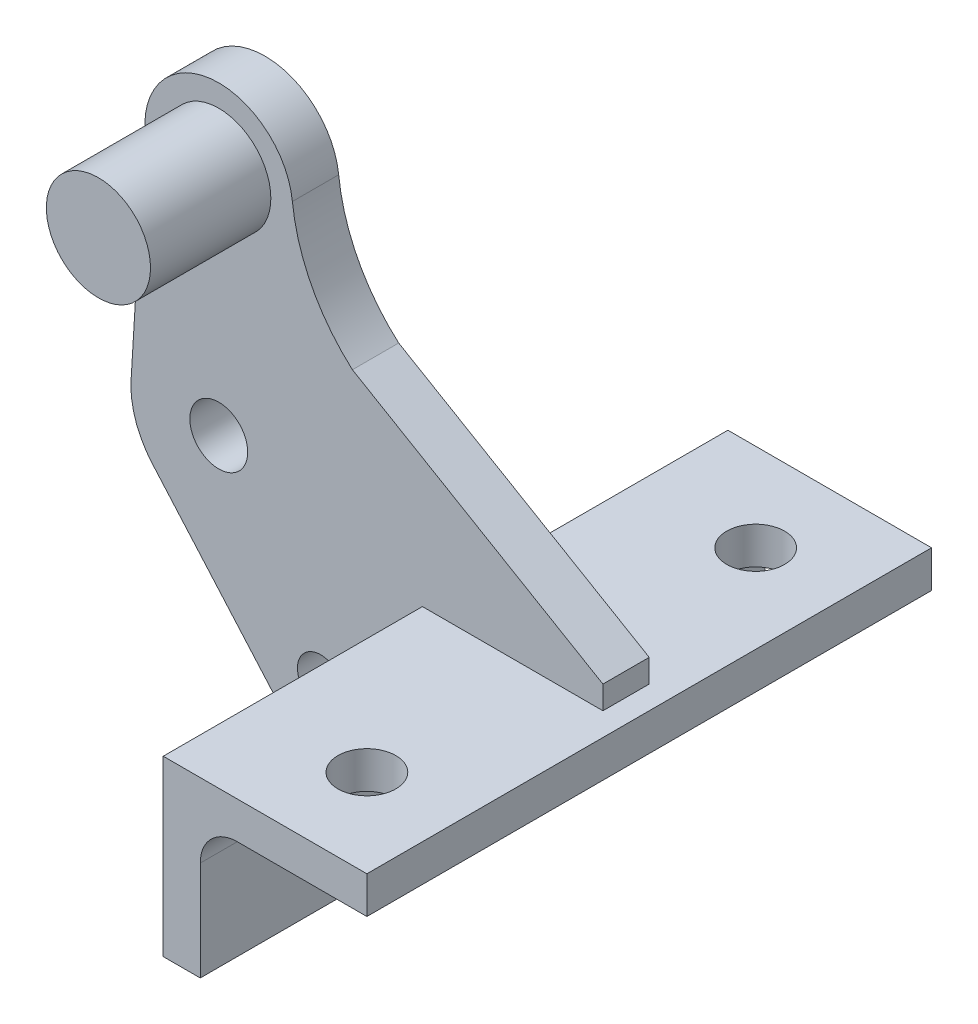
ISO-10303-21;
HEADER;
FILE_DESCRIPTION(('STEP AP214'),'2;1');
FILE_NAME('part.step','',(''),(''),'','','');
FILE_SCHEMA(('AUTOMOTIVE_DESIGN { 1 0 10303 214 1 1 1 1 }'));
ENDSEC;
DATA;
#1=APPLICATION_CONTEXT('core data for automotive mechanical design processes');
#2=APPLICATION_PROTOCOL_DEFINITION('international standard','automotive_design',2000,#1);
#3=PRODUCT_CONTEXT('',#1,'mechanical');
#4=PRODUCT('Part','Part','',(#3));
#5=PRODUCT_RELATED_PRODUCT_CATEGORY('part','',(#4));
#6=PRODUCT_DEFINITION_FORMATION('','',#4);
#7=PRODUCT_DEFINITION_CONTEXT('part definition',#1,'design');
#8=PRODUCT_DEFINITION('design','',#6,#7);
#9=PRODUCT_DEFINITION_SHAPE('','',#8);
#10=(LENGTH_UNIT() NAMED_UNIT(*) SI_UNIT(.MILLI.,.METRE.));
#11=(NAMED_UNIT(*) PLANE_ANGLE_UNIT() SI_UNIT($,.RADIAN.));
#12=(NAMED_UNIT(*) SI_UNIT($,.STERADIAN.) SOLID_ANGLE_UNIT());
#13=UNCERTAINTY_MEASURE_WITH_UNIT(LENGTH_MEASURE(1.E-05),#10,'distance_accuracy_value','');
#14=(GEOMETRIC_REPRESENTATION_CONTEXT(3) GLOBAL_UNCERTAINTY_ASSIGNED_CONTEXT((#13)) GLOBAL_UNIT_ASSIGNED_CONTEXT((#10,
#11,#12)) REPRESENTATION_CONTEXT('',''));
#15=CARTESIAN_POINT('',(0.,0.,0.));
#16=DIRECTION('',(0.,0.,1.));
#17=DIRECTION('',(1.,0.,0.));
#18=AXIS2_PLACEMENT_3D('',#15,#16,#17);
#19=CARTESIAN_POINT('',(0.,0.,10.));
#20=DIRECTION('',(0.,0.,1.));
#21=DIRECTION('',(1.,0.,0.));
#22=AXIS2_PLACEMENT_3D('',#19,#20,#21);
#23=PLANE('',#22);
#24=CARTESIAN_POINT('',(-44.,25.,10.));
#25=DIRECTION('',(0.,0.,1.));
#26=DIRECTION('',(1.,0.,0.));
#27=AXIS2_PLACEMENT_3D('',#24,#25,#26);
#28=CIRCLE('',#27,10.);
#29=CARTESIAN_POINT('',(-34.,25.,10.));
#30=VERTEX_POINT('',#29);
#31=EDGE_CURVE('E263',#30,#30,#28,.T.);
#32=ORIENTED_EDGE('',*,*,#31,.F.);
#33=EDGE_LOOP('',(#32));
#34=FACE_BOUND('',#33,.T.);
#35=CARTESIAN_POINT('',(-88.,95.,10.));
#36=DIRECTION('',(0.,0.,1.));
#37=DIRECTION('',(1.,0.,0.));
#38=AXIS2_PLACEMENT_3D('',#35,#36,#37);
#39=CIRCLE('',#38,12.5);
#40=CARTESIAN_POINT('',(-75.5,95.,10.));
#41=VERTEX_POINT('',#40);
#42=EDGE_CURVE('E260',#41,#41,#39,.T.);
#43=ORIENTED_EDGE('',*,*,#42,.F.);
#44=EDGE_LOOP('',(#43));
#45=FACE_BOUND('',#44,.T.);
#46=CARTESIAN_POINT('',(21.3434954626932,207.,10.));
#47=DIRECTION('',(0.,0.,1.));
#48=DIRECTION('',(1.,0.,0.));
#49=AXIS2_PLACEMENT_3D('',#46,#47,#48);
#50=CIRCLE('',#49,78.);
#51=CARTESIAN_POINT('',(-56.1909831381256,198.490909090909,10.));
#52=VERTEX_POINT('',#51);
#53=CARTESIAN_POINT('',(-30.24635358457,148.497970331957,10.));
#54=VERTEX_POINT('',#53);
#55=EDGE_CURVE('E217',#52,#54,#50,.T.);
#56=ORIENTED_EDGE('',*,*,#55,.F.);
#57=CARTESIAN_POINT('',(-88.,195.,10.));
#58=DIRECTION('',(0.,0.,1.));
#59=DIRECTION('',(1.,0.,0.));
#60=AXIS2_PLACEMENT_3D('',#57,#58,#59);
#61=CIRCLE('',#60,32.);
#62=CARTESIAN_POINT('',(-119.660096955048,199.651694400639,10.));
#63=VERTEX_POINT('',#62);
#64=EDGE_CURVE('E232',#63,#52,#61,.F.);
#65=ORIENTED_EDGE('',*,*,#64,.F.);
#66=DIRECTION('',(0.0604701252704725,0.998170007538682,0.));
#67=VECTOR('',#66,1.);
#68=CARTESIAN_POINT('',(-131.273413070395,7.9526730648052,10.));
#69=LINE('',#68,#67);
#70=CARTESIAN_POINT('',(-126.,95.,10.));
#71=VERTEX_POINT('',#70);
#72=EDGE_CURVE('E235',#71,#63,#69,.T.);
#73=ORIENTED_EDGE('',*,*,#72,.F.);
#74=CARTESIAN_POINT('',(-88.,95.,10.));
#75=DIRECTION('',(0.,0.,1.));
#76=DIRECTION('',(1.,0.,0.));
#77=AXIS2_PLACEMENT_3D('',#74,#75,#76);
#78=CIRCLE('',#77,38.);
#79=CARTESIAN_POINT('',(-116.254110735657,69.5892694607719,10.));
#80=VERTEX_POINT('',#79);
#81=EDGE_CURVE('E238',#80,#71,#78,.F.);
#82=ORIENTED_EDGE('',*,*,#81,.F.);
#83=DIRECTION('',(0.658660174281462,-0.752440545701462,0.));
#84=VECTOR('',#83,1.);
#85=CARTESIAN_POINT('',(-31.3305905982339,-27.4257047705155,10.));
#86=LINE('',#85,#84);
#87=CARTESIAN_POINT('',(-62.5882307471425,8.28241411892891,10.));
#88=VERTEX_POINT('',#87);
#89=EDGE_CURVE('E241',#80,#88,#86,.T.);
#90=ORIENTED_EDGE('',*,*,#89,.T.);
#91=CARTESIAN_POINT('',(-44.,25.,10.));
#92=DIRECTION('',(0.,0.,1.));
#93=DIRECTION('',(1.,0.,0.));
#94=AXIS2_PLACEMENT_3D('',#91,#92,#93);
#95=CIRCLE('',#94,25.);
#96=CARTESIAN_POINT('',(-44.,0.,10.));
#97=VERTEX_POINT('',#96);
#98=EDGE_CURVE('E244',#97,#88,#95,.F.);
#99=ORIENTED_EDGE('',*,*,#98,.F.);
#100=DIRECTION('',(-1.,0.,0.));
#101=VECTOR('',#100,1.);
#102=CARTESIAN_POINT('',(0.,0.,10.));
#103=LINE('',#102,#101);
#104=CARTESIAN_POINT('',(0.,0.,10.));
#105=VERTEX_POINT('',#104);
#106=EDGE_CURVE('E247',#105,#97,#103,.T.);
#107=ORIENTED_EDGE('',*,*,#106,.F.);
#108=DIRECTION('',(0.,1.,0.));
#109=VECTOR('',#108,1.);
#110=CARTESIAN_POINT('',(0.,0.,10.));
#111=LINE('',#110,#109);
#112=CARTESIAN_POINT('',(0.,75.,10.));
#113=VERTEX_POINT('',#112);
#114=EDGE_CURVE('E250',#105,#113,#111,.T.);
#115=ORIENTED_EDGE('',*,*,#114,.T.);
#116=DIRECTION('',(1.,0.,0.));
#117=VECTOR('',#116,1.);
#118=CARTESIAN_POINT('',(0.,75.,10.));
#119=LINE('',#118,#117);
#120=CARTESIAN_POINT('',(78.,75.,10.));
#121=VERTEX_POINT('',#120);
#122=EDGE_CURVE('E252',#113,#121,#119,.T.);
#123=ORIENTED_EDGE('',*,*,#122,.T.);
#124=DIRECTION('',(0.,1.,0.));
#125=VECTOR('',#124,1.);
#126=CARTESIAN_POINT('',(78.,0.,10.));
#127=LINE('',#126,#125);
#128=CARTESIAN_POINT('',(78.,85.,10.));
#129=VERTEX_POINT('',#128);
#130=EDGE_CURVE('E254',#121,#129,#127,.T.);
#131=ORIENTED_EDGE('',*,*,#130,.T.);
#132=DIRECTION('',(0.862547709185101,-0.505975739912038,0.));
#133=VECTOR('',#132,1.);
#134=CARTESIAN_POINT('',(57.0652913575747,97.28042760116,10.));
#135=LINE('',#134,#133);
#136=EDGE_CURVE('E257',#54,#129,#135,.T.);
#137=ORIENTED_EDGE('',*,*,#136,.F.);
#138=EDGE_LOOP('',(#56,#65,#73,#82,#90,#99,#107,#115,#123,#131,#137));
#139=FACE_BOUND('',#138,.T.);
#140=CARTESIAN_POINT('',(-88.,195.,10.));
#141=DIRECTION('',(0.,0.,1.));
#142=DIRECTION('',(1.,0.,0.));
#143=AXIS2_PLACEMENT_3D('',#140,#141,#142);
#144=CIRCLE('',#143,22.5);
#145=CARTESIAN_POINT('',(-65.5,195.,10.));
#146=VERTEX_POINT('',#145);
#147=EDGE_CURVE('E36',#146,#146,#144,.T.);
#148=ORIENTED_EDGE('',*,*,#147,.F.);
#149=EDGE_LOOP('',(#148));
#150=FACE_BOUND('',#149,.T.);
#151=ADVANCED_FACE('F32',(#34,#45,#139,#150),#23,.T.);
#152=CARTESIAN_POINT('',(21.3434954626932,207.,-10.));
#153=DIRECTION('',(0.,0.,1.));
#154=DIRECTION('',(1.,0.,0.));
#155=AXIS2_PLACEMENT_3D('',#152,#153,#154);
#156=CYLINDRICAL_SURFACE('',#155,78.);
#157=DIRECTION('',(0.,0.,1.));
#158=VECTOR('',#157,1.);
#159=CARTESIAN_POINT('',(-56.1909831381256,198.490909090909,-10.));
#160=LINE('',#159,#158);
#161=CARTESIAN_POINT('',(-56.1909831381256,198.490909090909,-10.));
#162=VERTEX_POINT('',#161);
#163=EDGE_CURVE('E297',#162,#52,#160,.T.);
#164=ORIENTED_EDGE('',*,*,#163,.T.);
#165=ORIENTED_EDGE('',*,*,#55,.T.);
#166=DIRECTION('',(0.,0.,1.));
#167=VECTOR('',#166,1.);
#168=CARTESIAN_POINT('',(-30.24635358457,148.497970331957,-10.));
#169=LINE('',#168,#167);
#170=CARTESIAN_POINT('',(-30.24635358457,148.497970331957,-10.));
#171=VERTEX_POINT('',#170);
#172=EDGE_CURVE('E298',#171,#54,#169,.T.);
#173=ORIENTED_EDGE('',*,*,#172,.F.);
#174=CARTESIAN_POINT('',(21.3434954626932,207.,-10.));
#175=DIRECTION('',(0.,0.,1.));
#176=DIRECTION('',(1.,0.,0.));
#177=AXIS2_PLACEMENT_3D('',#174,#175,#176);
#178=CIRCLE('',#177,78.);
#179=EDGE_CURVE('E266',#162,#171,#178,.T.);
#180=ORIENTED_EDGE('',*,*,#179,.F.);
#181=EDGE_LOOP('',(#164,#165,#173,#180));
#182=FACE_BOUND('',#181,.T.);
#183=ADVANCED_FACE('F319',(#182),#156,.F.);
#184=CARTESIAN_POINT('',(57.0652913575747,97.28042760116,-10.));
#185=DIRECTION('',(-0.505975739912038,-0.862547709185101,0.));
#186=DIRECTION('',(0.862547709185101,-0.505975739912038,0.));
#187=AXIS2_PLACEMENT_3D('',#184,#185,#186);
#188=PLANE('',#187);
#189=ORIENTED_EDGE('',*,*,#172,.T.);
#190=ORIENTED_EDGE('',*,*,#136,.T.);
#191=DIRECTION('',(0.,0.,1.));
#192=VECTOR('',#191,1.);
#193=CARTESIAN_POINT('',(78.,85.,-10.));
#194=LINE('',#193,#192);
#195=CARTESIAN_POINT('',(78.,85.,-10.));
#196=VERTEX_POINT('',#195);
#197=EDGE_CURVE('E300',#196,#129,#194,.T.);
#198=ORIENTED_EDGE('',*,*,#197,.F.);
#199=DIRECTION('',(0.862547709185101,-0.505975739912038,0.));
#200=VECTOR('',#199,1.);
#201=CARTESIAN_POINT('',(57.0652913575747,97.28042760116,-10.));
#202=LINE('',#201,#200);
#203=EDGE_CURVE('E47',#171,#196,#202,.T.);
#204=ORIENTED_EDGE('',*,*,#203,.F.);
#205=EDGE_LOOP('',(#189,#190,#198,#204));
#206=FACE_BOUND('',#205,.T.);
#207=ADVANCED_FACE('F376',(#206),#188,.F.);
#208=CARTESIAN_POINT('',(78.,0.,-10.));
#209=DIRECTION('',(1.,0.,0.));
#210=DIRECTION('',(0.,0.,-1.));
#211=AXIS2_PLACEMENT_3D('',#208,#209,#210);
#212=PLANE('',#211);
#213=ORIENTED_EDGE('',*,*,#197,.T.);
#214=ORIENTED_EDGE('',*,*,#130,.F.);
#215=DIRECTION('',(0.,0.,1.));
#216=VECTOR('',#215,1.);
#217=CARTESIAN_POINT('',(78.,75.,-10.));
#218=LINE('',#217,#216);
#219=CARTESIAN_POINT('',(78.,75.,-10.));
#220=VERTEX_POINT('',#219);
#221=EDGE_CURVE('E302',#220,#121,#218,.T.);
#222=ORIENTED_EDGE('',*,*,#221,.F.);
#223=DIRECTION('',(0.,1.,0.));
#224=VECTOR('',#223,1.);
#225=CARTESIAN_POINT('',(78.,0.,-10.));
#226=LINE('',#225,#224);
#227=EDGE_CURVE('E287',#220,#196,#226,.T.);
#228=ORIENTED_EDGE('',*,*,#227,.T.);
#229=EDGE_LOOP('',(#213,#214,#222,#228));
#230=FACE_BOUND('',#229,.T.);
#231=ADVANCED_FACE('F375',(#230),#212,.T.);
#232=CARTESIAN_POINT('',(0.,0.,-10.));
#233=DIRECTION('',(0.,1.,0.));
#234=DIRECTION('',(0.,0.,1.));
#235=AXIS2_PLACEMENT_3D('',#232,#233,#234);
#236=PLANE('',#235);
#237=DIRECTION('',(-1.,0.,0.));
#238=VECTOR('',#237,1.);
#239=CARTESIAN_POINT('',(0.,0.,-10.));
#240=LINE('',#239,#238);
#241=CARTESIAN_POINT('',(0.,0.,-10.));
#242=VERTEX_POINT('',#241);
#243=CARTESIAN_POINT('',(-44.,0.,-10.));
#244=VERTEX_POINT('',#243);
#245=EDGE_CURVE('E279',#242,#244,#240,.T.);
#246=ORIENTED_EDGE('',*,*,#245,.F.);
#247=DIRECTION('',(0.,0.,1.));
#248=VECTOR('',#247,1.);
#249=CARTESIAN_POINT('',(0.,0.,-122.));
#250=LINE('',#249,#248);
#251=CARTESIAN_POINT('',(0.,0.,-122.));
#252=VERTEX_POINT('',#251);
#253=EDGE_CURVE('E214',#252,#242,#250,.T.);
#254=ORIENTED_EDGE('',*,*,#253,.F.);
#255=DIRECTION('',(1.,0.,0.));
#256=VECTOR('',#255,1.);
#257=CARTESIAN_POINT('',(16.,0.,-122.));
#258=LINE('',#257,#256);
#259=CARTESIAN_POINT('',(16.,0.,-122.));
#260=VERTEX_POINT('',#259);
#261=EDGE_CURVE('E161',#252,#260,#258,.T.);
#262=ORIENTED_EDGE('',*,*,#261,.T.);
#263=DIRECTION('',(0.,0.,1.));
#264=VECTOR('',#263,1.);
#265=CARTESIAN_POINT('',(16.,0.,-122.));
#266=LINE('',#265,#264);
#267=CARTESIAN_POINT('',(16.,0.,122.));
#268=VERTEX_POINT('',#267);
#269=EDGE_CURVE('E154',#260,#268,#266,.T.);
#270=ORIENTED_EDGE('',*,*,#269,.T.);
#271=DIRECTION('',(1.,0.,0.));
#272=VECTOR('',#271,1.);
#273=CARTESIAN_POINT('',(16.,0.,122.));
#274=LINE('',#273,#272);
#275=CARTESIAN_POINT('',(0.,0.,122.));
#276=VERTEX_POINT('',#275);
#277=EDGE_CURVE('E159',#276,#268,#274,.T.);
#278=ORIENTED_EDGE('',*,*,#277,.F.);
#279=EDGE_CURVE('E218',#105,#276,#250,.T.);
#280=ORIENTED_EDGE('',*,*,#279,.F.);
#281=ORIENTED_EDGE('',*,*,#106,.T.);
#282=DIRECTION('',(0.,0.,1.));
#283=VECTOR('',#282,1.);
#284=CARTESIAN_POINT('',(-44.,0.,-10.));
#285=LINE('',#284,#283);
#286=EDGE_CURVE('E305',#244,#97,#285,.T.);
#287=ORIENTED_EDGE('',*,*,#286,.F.);
#288=EDGE_LOOP('',(#246,#254,#262,#270,#278,#280,#281,#287));
#289=FACE_BOUND('',#288,.T.);
#290=ADVANCED_FACE('F156',(#289),#236,.F.);
#291=CARTESIAN_POINT('',(-44.,25.,-10.));
#292=DIRECTION('',(0.,0.,1.));
#293=DIRECTION('',(1.,0.,0.));
#294=AXIS2_PLACEMENT_3D('',#291,#292,#293);
#295=CYLINDRICAL_SURFACE('',#294,25.);
#296=ORIENTED_EDGE('',*,*,#286,.T.);
#297=ORIENTED_EDGE('',*,*,#98,.T.);
#298=DIRECTION('',(0.,0.,1.));
#299=VECTOR('',#298,1.);
#300=CARTESIAN_POINT('',(-62.5882307471425,8.28241411892891,-10.));
#301=LINE('',#300,#299);
#302=CARTESIAN_POINT('',(-62.5882307471425,8.28241411892891,-10.));
#303=VERTEX_POINT('',#302);
#304=EDGE_CURVE('E307',#303,#88,#301,.T.);
#305=ORIENTED_EDGE('',*,*,#304,.F.);
#306=CARTESIAN_POINT('',(-44.,25.,-10.));
#307=DIRECTION('',(0.,0.,1.));
#308=DIRECTION('',(1.,0.,0.));
#309=AXIS2_PLACEMENT_3D('',#306,#307,#308);
#310=CIRCLE('',#309,25.);
#311=EDGE_CURVE('E277',#244,#303,#310,.F.);
#312=ORIENTED_EDGE('',*,*,#311,.F.);
#313=EDGE_LOOP('',(#296,#297,#305,#312));
#314=FACE_BOUND('',#313,.T.);
#315=ADVANCED_FACE('F345',(#314),#295,.T.);
#316=CARTESIAN_POINT('',(-31.3305905982339,-27.4257047705155,-10.));
#317=DIRECTION('',(-0.752440545701462,-0.658660174281462,0.));
#318=DIRECTION('',(0.658660174281462,-0.752440545701462,0.));
#319=AXIS2_PLACEMENT_3D('',#316,#317,#318);
#320=PLANE('',#319);
#321=ORIENTED_EDGE('',*,*,#304,.T.);
#322=ORIENTED_EDGE('',*,*,#89,.F.);
#323=DIRECTION('',(0.,0.,1.));
#324=VECTOR('',#323,1.);
#325=CARTESIAN_POINT('',(-116.254110735657,69.5892694607719,-10.));
#326=LINE('',#325,#324);
#327=CARTESIAN_POINT('',(-116.254110735657,69.5892694607719,-10.));
#328=VERTEX_POINT('',#327);
#329=EDGE_CURVE('E309',#328,#80,#326,.T.);
#330=ORIENTED_EDGE('',*,*,#329,.F.);
#331=DIRECTION('',(0.658660174281462,-0.752440545701462,0.));
#332=VECTOR('',#331,1.);
#333=CARTESIAN_POINT('',(-31.3305905982339,-27.4257047705155,-10.));
#334=LINE('',#333,#332);
#335=EDGE_CURVE('E274',#328,#303,#334,.T.);
#336=ORIENTED_EDGE('',*,*,#335,.T.);
#337=EDGE_LOOP('',(#321,#322,#330,#336));
#338=FACE_BOUND('',#337,.T.);
#339=ADVANCED_FACE('F341',(#338),#320,.T.);
#340=CARTESIAN_POINT('',(-88.,95.,-10.));
#341=DIRECTION('',(0.,0.,1.));
#342=DIRECTION('',(1.,0.,0.));
#343=AXIS2_PLACEMENT_3D('',#340,#341,#342);
#344=CYLINDRICAL_SURFACE('',#343,38.);
#345=ORIENTED_EDGE('',*,*,#329,.T.);
#346=ORIENTED_EDGE('',*,*,#81,.T.);
#347=DIRECTION('',(0.,0.,1.));
#348=VECTOR('',#347,1.);
#349=CARTESIAN_POINT('',(-126.,95.,-10.));
#350=LINE('',#349,#348);
#351=CARTESIAN_POINT('',(-126.,95.,-10.));
#352=VERTEX_POINT('',#351);
#353=EDGE_CURVE('E311',#352,#71,#350,.T.);
#354=ORIENTED_EDGE('',*,*,#353,.F.);
#355=CARTESIAN_POINT('',(-88.,95.,-10.));
#356=DIRECTION('',(0.,0.,1.));
#357=DIRECTION('',(1.,0.,0.));
#358=AXIS2_PLACEMENT_3D('',#355,#356,#357);
#359=CIRCLE('',#358,38.);
#360=EDGE_CURVE('E272',#328,#352,#359,.F.);
#361=ORIENTED_EDGE('',*,*,#360,.F.);
#362=EDGE_LOOP('',(#345,#346,#354,#361));
#363=FACE_BOUND('',#362,.T.);
#364=ADVANCED_FACE('F336',(#363),#344,.T.);
#365=CARTESIAN_POINT('',(-131.273413070395,7.9526730648052,-10.));
#366=DIRECTION('',(0.998170007538682,-0.0604701252704725,0.));
#367=DIRECTION('',(0.0604701252704725,0.998170007538682,0.));
#368=AXIS2_PLACEMENT_3D('',#365,#366,#367);
#369=PLANE('',#368);
#370=ORIENTED_EDGE('',*,*,#353,.T.);
#371=ORIENTED_EDGE('',*,*,#72,.T.);
#372=DIRECTION('',(0.,0.,1.));
#373=VECTOR('',#372,1.);
#374=CARTESIAN_POINT('',(-119.660096955048,199.651694400639,-10.));
#375=LINE('',#374,#373);
#376=CARTESIAN_POINT('',(-119.660096955048,199.651694400639,-10.));
#377=VERTEX_POINT('',#376);
#378=EDGE_CURVE('E313',#377,#63,#375,.T.);
#379=ORIENTED_EDGE('',*,*,#378,.F.);
#380=DIRECTION('',(0.0604701252704725,0.998170007538682,0.));
#381=VECTOR('',#380,1.);
#382=CARTESIAN_POINT('',(-131.273413070395,7.9526730648052,-10.));
#383=LINE('',#382,#381);
#384=EDGE_CURVE('E270',#352,#377,#383,.T.);
#385=ORIENTED_EDGE('',*,*,#384,.F.);
#386=EDGE_LOOP('',(#370,#371,#379,#385));
#387=FACE_BOUND('',#386,.T.);
#388=ADVANCED_FACE('F332',(#387),#369,.F.);
#389=CARTESIAN_POINT('',(-88.,95.,-10.));
#390=DIRECTION('',(0.,0.,1.));
#391=DIRECTION('',(1.,0.,0.));
#392=AXIS2_PLACEMENT_3D('',#389,#390,#391);
#393=CYLINDRICAL_SURFACE('',#392,12.5);
#394=CARTESIAN_POINT('',(-88.,95.,-10.));
#395=DIRECTION('',(0.,0.,1.));
#396=DIRECTION('',(1.,0.,0.));
#397=AXIS2_PLACEMENT_3D('',#394,#395,#396);
#398=CIRCLE('',#397,12.5);
#399=CARTESIAN_POINT('',(-75.5,95.,-10.));
#400=VERTEX_POINT('',#399);
#401=EDGE_CURVE('E291',#400,#400,#398,.T.);
#402=ORIENTED_EDGE('',*,*,#401,.F.);
#403=EDGE_LOOP('',(#402));
#404=FACE_BOUND('',#403,.T.);
#405=ORIENTED_EDGE('',*,*,#42,.T.);
#406=EDGE_LOOP('',(#405));
#407=FACE_BOUND('',#406,.T.);
#408=ADVANCED_FACE('F401',(#404,#407),#393,.F.);
#409=CARTESIAN_POINT('',(-88.,195.,-10.));
#410=DIRECTION('',(0.,0.,1.));
#411=DIRECTION('',(1.,0.,0.));
#412=AXIS2_PLACEMENT_3D('',#409,#410,#411);
#413=CYLINDRICAL_SURFACE('',#412,32.);
#414=ORIENTED_EDGE('',*,*,#378,.T.);
#415=ORIENTED_EDGE('',*,*,#64,.T.);
#416=ORIENTED_EDGE('',*,*,#163,.F.);
#417=CARTESIAN_POINT('',(-88.,195.,-10.));
#418=DIRECTION('',(0.,0.,1.));
#419=DIRECTION('',(1.,0.,0.));
#420=AXIS2_PLACEMENT_3D('',#417,#418,#419);
#421=CIRCLE('',#420,32.);
#422=EDGE_CURVE('E268',#377,#162,#421,.F.);
#423=ORIENTED_EDGE('',*,*,#422,.F.);
#424=EDGE_LOOP('',(#414,#415,#416,#423));
#425=FACE_BOUND('',#424,.T.);
#426=ADVANCED_FACE('F328',(#425),#413,.T.);
#427=CARTESIAN_POINT('',(-44.,25.,-10.));
#428=DIRECTION('',(0.,0.,1.));
#429=DIRECTION('',(1.,0.,0.));
#430=AXIS2_PLACEMENT_3D('',#427,#428,#429);
#431=CYLINDRICAL_SURFACE('',#430,10.);
#432=CARTESIAN_POINT('',(-44.,25.,-10.));
#433=DIRECTION('',(0.,0.,1.));
#434=DIRECTION('',(1.,0.,0.));
#435=AXIS2_PLACEMENT_3D('',#432,#433,#434);
#436=CIRCLE('',#435,10.);
#437=CARTESIAN_POINT('',(-34.,25.,-10.));
#438=VERTEX_POINT('',#437);
#439=EDGE_CURVE('E294',#438,#438,#436,.T.);
#440=ORIENTED_EDGE('',*,*,#439,.F.);
#441=EDGE_LOOP('',(#440));
#442=FACE_BOUND('',#441,.T.);
#443=ORIENTED_EDGE('',*,*,#31,.T.);
#444=EDGE_LOOP('',(#443));
#445=FACE_BOUND('',#444,.T.);
#446=ADVANCED_FACE('F398',(#442,#445),#431,.F.);
#447=CARTESIAN_POINT('',(0.,0.,-10.));
#448=DIRECTION('',(0.,0.,1.));
#449=DIRECTION('',(1.,0.,0.));
#450=AXIS2_PLACEMENT_3D('',#447,#448,#449);
#451=PLANE('',#450);
#452=ORIENTED_EDGE('',*,*,#179,.T.);
#453=ORIENTED_EDGE('',*,*,#203,.T.);
#454=ORIENTED_EDGE('',*,*,#227,.F.);
#455=DIRECTION('',(1.,0.,0.));
#456=VECTOR('',#455,1.);
#457=CARTESIAN_POINT('',(0.,75.,-10.));
#458=LINE('',#457,#456);
#459=CARTESIAN_POINT('',(0.,75.,-10.));
#460=VERTEX_POINT('',#459);
#461=EDGE_CURVE('E284',#460,#220,#458,.T.);
#462=ORIENTED_EDGE('',*,*,#461,.F.);
#463=DIRECTION('',(0.,1.,0.));
#464=VECTOR('',#463,1.);
#465=CARTESIAN_POINT('',(0.,0.,-10.));
#466=LINE('',#465,#464);
#467=EDGE_CURVE('E281',#242,#460,#466,.T.);
#468=ORIENTED_EDGE('',*,*,#467,.F.);
#469=ORIENTED_EDGE('',*,*,#245,.T.);
#470=ORIENTED_EDGE('',*,*,#311,.T.);
#471=ORIENTED_EDGE('',*,*,#335,.F.);
#472=ORIENTED_EDGE('',*,*,#360,.T.);
#473=ORIENTED_EDGE('',*,*,#384,.T.);
#474=ORIENTED_EDGE('',*,*,#422,.T.);
#475=EDGE_LOOP('',(#452,#453,#454,#462,#468,#469,#470,#471,#472,#473,#474));
#476=FACE_BOUND('',#475,.T.);
#477=ORIENTED_EDGE('',*,*,#401,.T.);
#478=EDGE_LOOP('',(#477));
#479=FACE_BOUND('',#478,.T.);
#480=ORIENTED_EDGE('',*,*,#439,.T.);
#481=EDGE_LOOP('',(#480));
#482=FACE_BOUND('',#481,.T.);
#483=ADVANCED_FACE('F371',(#476,#479,#482),#451,.F.);
#484=CARTESIAN_POINT('',(-88.,195.,62.));
#485=DIRECTION('',(0.,0.,-1.));
#486=DIRECTION('',(-1.,0.,0.));
#487=AXIS2_PLACEMENT_3D('',#484,#485,#486);
#488=CYLINDRICAL_SURFACE('',#487,22.5);
#489=ORIENTED_EDGE('',*,*,#147,.T.);
#490=EDGE_LOOP('',(#489));
#491=FACE_BOUND('',#490,.T.);
#492=CARTESIAN_POINT('',(-88.,195.,62.));
#493=DIRECTION('',(0.,0.,1.));
#494=DIRECTION('',(1.,0.,0.));
#495=AXIS2_PLACEMENT_3D('',#492,#493,#494);
#496=CIRCLE('',#495,22.5);
#497=CARTESIAN_POINT('',(-65.5,195.,62.));
#498=VERTEX_POINT('',#497);
#499=EDGE_CURVE('E11',#498,#498,#496,.T.);
#500=ORIENTED_EDGE('',*,*,#499,.F.);
#501=EDGE_LOOP('',(#500));
#502=FACE_BOUND('',#501,.T.);
#503=ADVANCED_FACE('F34',(#491,#502),#488,.T.);
#504=CARTESIAN_POINT('',(-88.,195.,62.));
#505=DIRECTION('',(0.,0.,1.));
#506=DIRECTION('',(1.,0.,0.));
#507=AXIS2_PLACEMENT_3D('',#504,#505,#506);
#508=PLANE('',#507);
#509=ORIENTED_EDGE('',*,*,#499,.T.);
#510=EDGE_LOOP('',(#509));
#511=FACE_BOUND('',#510,.T.);
#512=ADVANCED_FACE('F421',(#511),#508,.T.);
#513=CARTESIAN_POINT('',(0.,0.,-122.));
#514=DIRECTION('',(-1.,0.,0.));
#515=DIRECTION('',(0.,0.,1.));
#516=AXIS2_PLACEMENT_3D('',#513,#514,#515);
#517=PLANE('',#516);
#518=ORIENTED_EDGE('',*,*,#467,.T.);
#519=DIRECTION('',(0.,0.,1.));
#520=VECTOR('',#519,1.);
#521=CARTESIAN_POINT('',(0.,75.,-122.));
#522=LINE('',#521,#520);
#523=CARTESIAN_POINT('',(0.,75.,-122.));
#524=VERTEX_POINT('',#523);
#525=EDGE_CURVE('E219',#524,#460,#522,.T.);
#526=ORIENTED_EDGE('',*,*,#525,.F.);
#527=DIRECTION('',(0.,-1.,0.));
#528=VECTOR('',#527,1.);
#529=CARTESIAN_POINT('',(0.,0.,-122.));
#530=LINE('',#529,#528);
#531=EDGE_CURVE('E166',#524,#252,#530,.T.);
#532=ORIENTED_EDGE('',*,*,#531,.T.);
#533=ORIENTED_EDGE('',*,*,#253,.T.);
#534=EDGE_LOOP('',(#518,#526,#532,#533));
#535=FACE_BOUND('',#534,.T.);
#536=ADVANCED_FACE('F369',(#535),#517,.T.);
#537=CARTESIAN_POINT('',(0.,75.,122.));
#538=VERTEX_POINT('',#537);
#539=EDGE_CURVE('E222',#113,#538,#522,.T.);
#540=ORIENTED_EDGE('',*,*,#539,.F.);
#541=ORIENTED_EDGE('',*,*,#114,.F.);
#542=ORIENTED_EDGE('',*,*,#279,.T.);
#543=DIRECTION('',(0.,-1.,0.));
#544=VECTOR('',#543,1.);
#545=CARTESIAN_POINT('',(0.,0.,122.));
#546=LINE('',#545,#544);
#547=EDGE_CURVE('E180',#538,#276,#546,.T.);
#548=ORIENTED_EDGE('',*,*,#547,.F.);
#549=EDGE_LOOP('',(#540,#541,#542,#548));
#550=FACE_BOUND('',#549,.T.);
#551=ADVANCED_FACE('F353',(#550),#517,.T.);
#552=CARTESIAN_POINT('',(0.,75.,-122.));
#553=DIRECTION('',(0.,1.,0.));
#554=DIRECTION('',(-1.,0.,0.));
#555=AXIS2_PLACEMENT_3D('',#552,#553,#554);
#556=PLANE('',#555);
#557=CARTESIAN_POINT('',(50.,75.,-84.));
#558=DIRECTION('',(0.,1.,0.));
#559=DIRECTION('',(-1.,0.,0.));
#560=AXIS2_PLACEMENT_3D('',#557,#558,#559);
#561=CIRCLE('',#560,12.5);
#562=CARTESIAN_POINT('',(37.5,75.,-84.));
#563=VERTEX_POINT('',#562);
#564=EDGE_CURVE('E623',#563,#563,#561,.T.);
#565=ORIENTED_EDGE('',*,*,#564,.F.);
#566=EDGE_LOOP('',(#565));
#567=FACE_BOUND('',#566,.T.);
#568=CARTESIAN_POINT('',(50.,75.,84.));
#569=DIRECTION('',(0.,1.,0.));
#570=DIRECTION('',(-1.,0.,0.));
#571=AXIS2_PLACEMENT_3D('',#568,#569,#570);
#572=CIRCLE('',#571,12.5);
#573=CARTESIAN_POINT('',(37.5,75.,84.));
#574=VERTEX_POINT('',#573);
#575=EDGE_CURVE('E184',#574,#574,#572,.T.);
#576=ORIENTED_EDGE('',*,*,#575,.F.);
#577=EDGE_LOOP('',(#576));
#578=FACE_BOUND('',#577,.T.);
#579=ORIENTED_EDGE('',*,*,#221,.T.);
#580=ORIENTED_EDGE('',*,*,#122,.F.);
#581=ORIENTED_EDGE('',*,*,#539,.T.);
#582=DIRECTION('',(-1.,0.,0.));
#583=VECTOR('',#582,1.);
#584=CARTESIAN_POINT('',(78.,75.,122.));
#585=LINE('',#584,#583);
#586=CARTESIAN_POINT('',(88.,75.,122.));
#587=VERTEX_POINT('',#586);
#588=EDGE_CURVE('E195',#587,#538,#585,.T.);
#589=ORIENTED_EDGE('',*,*,#588,.F.);
#590=DIRECTION('',(0.,0.,1.));
#591=VECTOR('',#590,1.);
#592=CARTESIAN_POINT('',(88.,75.,-122.));
#593=LINE('',#592,#591);
#594=CARTESIAN_POINT('',(88.,75.,-122.));
#595=VERTEX_POINT('',#594);
#596=EDGE_CURVE('E223',#595,#587,#593,.T.);
#597=ORIENTED_EDGE('',*,*,#596,.F.);
#598=DIRECTION('',(-1.,0.,0.));
#599=VECTOR('',#598,1.);
#600=CARTESIAN_POINT('',(78.,75.,-122.));
#601=LINE('',#600,#599);
#602=EDGE_CURVE('E210',#595,#524,#601,.T.);
#603=ORIENTED_EDGE('',*,*,#602,.T.);
#604=ORIENTED_EDGE('',*,*,#525,.T.);
#605=ORIENTED_EDGE('',*,*,#461,.T.);
#606=EDGE_LOOP('',(#579,#580,#581,#589,#597,#603,#604,#605));
#607=FACE_BOUND('',#606,.T.);
#608=ADVANCED_FACE('F356',(#567,#578,#607),#556,.T.);
#609=CARTESIAN_POINT('',(88.,75.,-122.));
#610=DIRECTION('',(1.,0.,0.));
#611=DIRECTION('',(0.,0.,-1.));
#612=AXIS2_PLACEMENT_3D('',#609,#610,#611);
#613=PLANE('',#612);
#614=ORIENTED_EDGE('',*,*,#596,.T.);
#615=DIRECTION('',(0.,1.,0.));
#616=VECTOR('',#615,1.);
#617=CARTESIAN_POINT('',(88.,75.,122.));
#618=LINE('',#617,#616);
#619=CARTESIAN_POINT('',(88.,59.,122.));
#620=VERTEX_POINT('',#619);
#621=EDGE_CURVE('E192',#620,#587,#618,.T.);
#622=ORIENTED_EDGE('',*,*,#621,.F.);
#623=DIRECTION('',(0.,0.,1.));
#624=VECTOR('',#623,1.);
#625=CARTESIAN_POINT('',(88.,59.,-122.));
#626=LINE('',#625,#624);
#627=CARTESIAN_POINT('',(88.,59.,-122.));
#628=VERTEX_POINT('',#627);
#629=EDGE_CURVE('E225',#628,#620,#626,.T.);
#630=ORIENTED_EDGE('',*,*,#629,.F.);
#631=DIRECTION('',(0.,1.,0.));
#632=VECTOR('',#631,1.);
#633=CARTESIAN_POINT('',(88.,75.,-122.));
#634=LINE('',#633,#632);
#635=EDGE_CURVE('E207',#628,#595,#634,.T.);
#636=ORIENTED_EDGE('',*,*,#635,.T.);
#637=EDGE_LOOP('',(#614,#622,#630,#636));
#638=FACE_BOUND('',#637,.T.);
#639=ADVANCED_FACE('F360',(#638),#613,.T.);
#640=CARTESIAN_POINT('',(88.,59.,-122.));
#641=DIRECTION('',(0.,-1.,0.));
#642=DIRECTION('',(1.,0.,0.));
#643=AXIS2_PLACEMENT_3D('',#640,#641,#642);
#644=PLANE('',#643);
#645=CARTESIAN_POINT('',(50.,59.,-84.));
#646=DIRECTION('',(0.,1.,0.));
#647=DIRECTION('',(-1.,0.,0.));
#648=AXIS2_PLACEMENT_3D('',#645,#646,#647);
#649=CIRCLE('',#648,12.5);
#650=CARTESIAN_POINT('',(37.5,59.,-84.));
#651=VERTEX_POINT('',#650);
#652=EDGE_CURVE('E620',#651,#651,#649,.T.);
#653=ORIENTED_EDGE('',*,*,#652,.T.);
#654=EDGE_LOOP('',(#653));
#655=FACE_BOUND('',#654,.T.);
#656=CARTESIAN_POINT('',(50.,59.,84.));
#657=DIRECTION('',(0.,1.,0.));
#658=DIRECTION('',(-1.,0.,0.));
#659=AXIS2_PLACEMENT_3D('',#656,#657,#658);
#660=CIRCLE('',#659,12.5);
#661=CARTESIAN_POINT('',(37.5,59.,84.));
#662=VERTEX_POINT('',#661);
#663=EDGE_CURVE('E181',#662,#662,#660,.T.);
#664=ORIENTED_EDGE('',*,*,#663,.T.);
#665=EDGE_LOOP('',(#664));
#666=FACE_BOUND('',#665,.T.);
#667=ORIENTED_EDGE('',*,*,#629,.T.);
#668=DIRECTION('',(1.,0.,0.));
#669=VECTOR('',#668,1.);
#670=CARTESIAN_POINT('',(88.,59.,122.));
#671=LINE('',#670,#669);
#672=CARTESIAN_POINT('',(32.0000000000001,59.,122.));
#673=VERTEX_POINT('',#672);
#674=EDGE_CURVE('E189',#673,#620,#671,.T.);
#675=ORIENTED_EDGE('',*,*,#674,.F.);
#676=DIRECTION('',(0.,0.,1.));
#677=VECTOR('',#676,1.);
#678=CARTESIAN_POINT('',(32.0000000000001,59.,-122.));
#679=LINE('',#678,#677);
#680=CARTESIAN_POINT('',(32.0000000000001,59.,-122.));
#681=VERTEX_POINT('',#680);
#682=EDGE_CURVE('E227',#681,#673,#679,.T.);
#683=ORIENTED_EDGE('',*,*,#682,.F.);
#684=DIRECTION('',(1.,0.,0.));
#685=VECTOR('',#684,1.);
#686=CARTESIAN_POINT('',(88.,59.,-122.));
#687=LINE('',#686,#685);
#688=EDGE_CURVE('E204',#681,#628,#687,.T.);
#689=ORIENTED_EDGE('',*,*,#688,.T.);
#690=EDGE_LOOP('',(#667,#675,#683,#689));
#691=FACE_BOUND('',#690,.T.);
#692=ADVANCED_FACE('F552',(#655,#666,#691),#644,.T.);
#693=CARTESIAN_POINT('',(32.,43.,-122.));
#694=DIRECTION('',(0.,0.,1.));
#695=DIRECTION('',(1.,0.,0.));
#696=AXIS2_PLACEMENT_3D('',#693,#694,#695);
#697=CYLINDRICAL_SURFACE('',#696,16.);
#698=ORIENTED_EDGE('',*,*,#682,.T.);
#699=CARTESIAN_POINT('',(32.,43.,122.));
#700=DIRECTION('',(0.,0.,-1.));
#701=DIRECTION('',(1.,0.,0.));
#702=AXIS2_PLACEMENT_3D('',#699,#700,#701);
#703=CIRCLE('',#702,16.);
#704=CARTESIAN_POINT('',(16.,42.9999999999999,122.));
#705=VERTEX_POINT('',#704);
#706=EDGE_CURVE('E174',#705,#673,#703,.T.);
#707=ORIENTED_EDGE('',*,*,#706,.F.);
#708=DIRECTION('',(0.,0.,1.));
#709=VECTOR('',#708,1.);
#710=CARTESIAN_POINT('',(16.,42.9999999999999,-122.));
#711=LINE('',#710,#709);
#712=CARTESIAN_POINT('',(16.,42.9999999999999,-122.));
#713=VERTEX_POINT('',#712);
#714=EDGE_CURVE('E165',#713,#705,#711,.T.);
#715=ORIENTED_EDGE('',*,*,#714,.F.);
#716=CARTESIAN_POINT('',(32.,43.,-122.));
#717=DIRECTION('',(0.,0.,-1.));
#718=DIRECTION('',(1.,0.,0.));
#719=AXIS2_PLACEMENT_3D('',#716,#717,#718);
#720=CIRCLE('',#719,16.);
#721=EDGE_CURVE('E201',#713,#681,#720,.T.);
#722=ORIENTED_EDGE('',*,*,#721,.T.);
#723=EDGE_LOOP('',(#698,#707,#715,#722));
#724=FACE_BOUND('',#723,.T.);
#725=ADVANCED_FACE('F560',(#724),#697,.F.);
#726=CARTESIAN_POINT('',(16.,42.9999999999999,-122.));
#727=DIRECTION('',(1.,0.,0.));
#728=DIRECTION('',(0.,1.,0.));
#729=AXIS2_PLACEMENT_3D('',#726,#727,#728);
#730=PLANE('',#729);
#731=ORIENTED_EDGE('',*,*,#714,.T.);
#732=DIRECTION('',(0.,1.,0.));
#733=VECTOR('',#732,1.);
#734=CARTESIAN_POINT('',(16.,42.9999999999999,122.));
#735=LINE('',#734,#733);
#736=EDGE_CURVE('E169',#268,#705,#735,.T.);
#737=ORIENTED_EDGE('',*,*,#736,.F.);
#738=ORIENTED_EDGE('',*,*,#269,.F.);
#739=DIRECTION('',(0.,1.,0.));
#740=VECTOR('',#739,1.);
#741=CARTESIAN_POINT('',(16.,42.9999999999999,-122.));
#742=LINE('',#741,#740);
#743=EDGE_CURVE('E199',#260,#713,#742,.T.);
#744=ORIENTED_EDGE('',*,*,#743,.T.);
#745=EDGE_LOOP('',(#731,#737,#738,#744));
#746=FACE_BOUND('',#745,.T.);
#747=ADVANCED_FACE('F170',(#746),#730,.T.);
#748=CARTESIAN_POINT('',(32.,43.,-122.));
#749=DIRECTION('',(0.,0.,1.));
#750=DIRECTION('',(1.,0.,0.));
#751=AXIS2_PLACEMENT_3D('',#748,#749,#750);
#752=PLANE('',#751);
#753=ORIENTED_EDGE('',*,*,#261,.F.);
#754=ORIENTED_EDGE('',*,*,#531,.F.);
#755=ORIENTED_EDGE('',*,*,#602,.F.);
#756=ORIENTED_EDGE('',*,*,#635,.F.);
#757=ORIENTED_EDGE('',*,*,#688,.F.);
#758=ORIENTED_EDGE('',*,*,#721,.F.);
#759=ORIENTED_EDGE('',*,*,#743,.F.);
#760=EDGE_LOOP('',(#753,#754,#755,#756,#757,#758,#759));
#761=FACE_BOUND('',#760,.T.);
#762=ADVANCED_FACE('F366',(#761),#752,.F.);
#763=CARTESIAN_POINT('',(32.,43.,122.));
#764=DIRECTION('',(0.,0.,1.));
#765=DIRECTION('',(1.,0.,0.));
#766=AXIS2_PLACEMENT_3D('',#763,#764,#765);
#767=PLANE('',#766);
#768=ORIENTED_EDGE('',*,*,#277,.T.);
#769=ORIENTED_EDGE('',*,*,#736,.T.);
#770=ORIENTED_EDGE('',*,*,#706,.T.);
#771=ORIENTED_EDGE('',*,*,#674,.T.);
#772=ORIENTED_EDGE('',*,*,#621,.T.);
#773=ORIENTED_EDGE('',*,*,#588,.T.);
#774=ORIENTED_EDGE('',*,*,#547,.T.);
#775=EDGE_LOOP('',(#768,#769,#770,#771,#772,#773,#774));
#776=FACE_BOUND('',#775,.T.);
#777=ADVANCED_FACE('F177',(#776),#767,.T.);
#778=CARTESIAN_POINT('',(50.,59.,84.));
#779=DIRECTION('',(0.,1.,0.));
#780=DIRECTION('',(-1.,0.,0.));
#781=AXIS2_PLACEMENT_3D('',#778,#779,#780);
#782=CYLINDRICAL_SURFACE('',#781,12.5);
#783=ORIENTED_EDGE('',*,*,#663,.F.);
#784=EDGE_LOOP('',(#783));
#785=FACE_BOUND('',#784,.T.);
#786=ORIENTED_EDGE('',*,*,#575,.T.);
#787=EDGE_LOOP('',(#786));
#788=FACE_BOUND('',#787,.T.);
#789=ADVANCED_FACE('F588',(#785,#788),#782,.F.);
#790=CARTESIAN_POINT('',(50.,59.,-84.));
#791=DIRECTION('',(0.,1.,0.));
#792=DIRECTION('',(-1.,0.,0.));
#793=AXIS2_PLACEMENT_3D('',#790,#791,#792);
#794=CYLINDRICAL_SURFACE('',#793,12.5);
#795=ORIENTED_EDGE('',*,*,#652,.F.);
#796=EDGE_LOOP('',(#795));
#797=FACE_BOUND('',#796,.T.);
#798=ORIENTED_EDGE('',*,*,#564,.T.);
#799=EDGE_LOOP('',(#798));
#800=FACE_BOUND('',#799,.T.);
#801=ADVANCED_FACE('F595',(#797,#800),#794,.F.);
#802=CLOSED_SHELL('',(#151,#183,#207,#231,#290,#315,#339,#364,#388,#408,#426,#446,#483,#503,
#512,#536,#551,#608,#639,#692,#725,#747,#762,#777,#789,#801));
#803=MANIFOLD_SOLID_BREP('B2',#802);
#804=ADVANCED_BREP_SHAPE_REPRESENTATION('',(#18,#803),#14);
#805=SHAPE_DEFINITION_REPRESENTATION(#9,#804);
ENDSEC;
END-ISO-10303-21;
